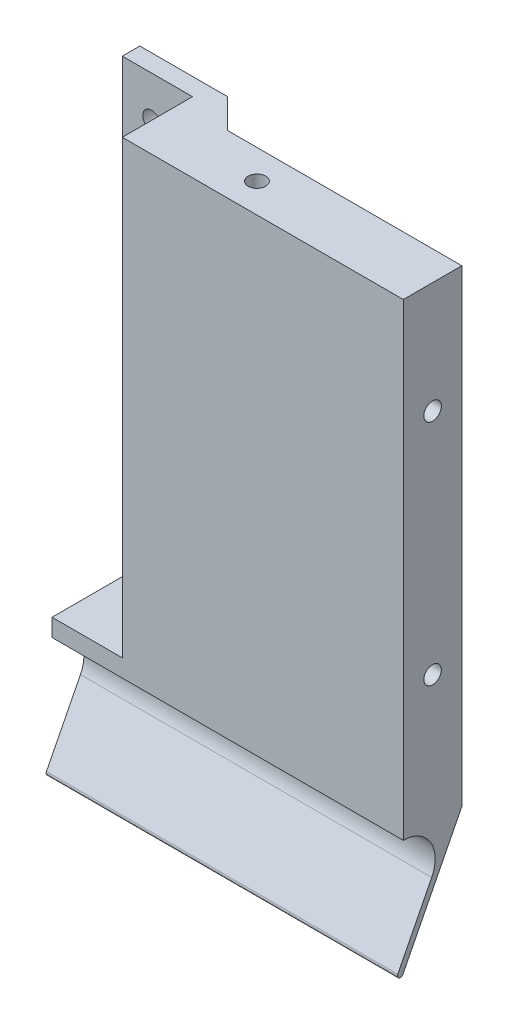
ISO-10303-21;
HEADER;
FILE_DESCRIPTION(('STEP AP214'),'2;1');
FILE_NAME('part.step','',(''),(''),'','','');
FILE_SCHEMA(('AUTOMOTIVE_DESIGN { 1 0 10303 214 1 1 1 1 }'));
ENDSEC;
DATA;
#1=APPLICATION_CONTEXT('core data for automotive mechanical design processes');
#2=APPLICATION_PROTOCOL_DEFINITION('international standard','automotive_design',2000,#1);
#3=PRODUCT_CONTEXT('',#1,'mechanical');
#4=PRODUCT('Part','Part','',(#3));
#5=PRODUCT_RELATED_PRODUCT_CATEGORY('part','',(#4));
#6=PRODUCT_DEFINITION_FORMATION('','',#4);
#7=PRODUCT_DEFINITION_CONTEXT('part definition',#1,'design');
#8=PRODUCT_DEFINITION('design','',#6,#7);
#9=PRODUCT_DEFINITION_SHAPE('','',#8);
#10=(LENGTH_UNIT() NAMED_UNIT(*) SI_UNIT(.MILLI.,.METRE.));
#11=(NAMED_UNIT(*) PLANE_ANGLE_UNIT() SI_UNIT($,.RADIAN.));
#12=(NAMED_UNIT(*) SI_UNIT($,.STERADIAN.) SOLID_ANGLE_UNIT());
#13=UNCERTAINTY_MEASURE_WITH_UNIT(LENGTH_MEASURE(1.E-05),#10,'distance_accuracy_value','');
#14=(GEOMETRIC_REPRESENTATION_CONTEXT(3) GLOBAL_UNCERTAINTY_ASSIGNED_CONTEXT((#13)) GLOBAL_UNIT_ASSIGNED_CONTEXT((#10,
#11,#12)) REPRESENTATION_CONTEXT('',''));
#15=CARTESIAN_POINT('',(0.,0.,0.));
#16=DIRECTION('',(0.,0.,1.));
#17=DIRECTION('',(1.,0.,0.));
#18=AXIS2_PLACEMENT_3D('',#15,#16,#17);
#19=CARTESIAN_POINT('',(-35.6969058074618,61.,-9.55555555555549));
#20=DIRECTION('',(-1.,0.,0.));
#21=DIRECTION('',(0.,0.,1.));
#22=AXIS2_PLACEMENT_3D('',#19,#20,#21);
#23=CYLINDRICAL_SURFACE('',#22,1.5);
#24=CARTESIAN_POINT('',(-83.6969058074618,61.,-9.55555555555549));
#25=DIRECTION('',(-1.,0.,0.));
#26=DIRECTION('',(0.,0.,1.));
#27=AXIS2_PLACEMENT_3D('',#24,#25,#26);
#28=CIRCLE('',#27,1.5);
#29=CARTESIAN_POINT('',(-83.6969058074618,61.,-8.05555555555549));
#30=VERTEX_POINT('',#29);
#31=EDGE_CURVE('E334',#30,#30,#28,.T.);
#32=ORIENTED_EDGE('',*,*,#31,.T.);
#33=EDGE_LOOP('',(#32));
#34=FACE_BOUND('',#33,.T.);
#35=CARTESIAN_POINT('',(-68.8778857874699,61.,-9.55555555555549));
#36=DIRECTION('',(0.866025403784437,-0.500000000000004,0.));
#37=DIRECTION('',(-0.500000000000004,-0.866025403784437,0.));
#38=AXIS2_PLACEMENT_3D('',#35,#36,#37);
#39=ELLIPSE('',#38,1.73205080756888,1.5);
#40=CARTESIAN_POINT('',(-69.7439111912544,59.5,-9.55555555555549));
#41=VERTEX_POINT('',#40);
#42=EDGE_CURVE('E248',#41,#41,#39,.F.);
#43=ORIENTED_EDGE('',*,*,#42,.F.);
#44=EDGE_LOOP('',(#43));
#45=FACE_BOUND('',#44,.T.);
#46=ADVANCED_FACE('F64',(#34,#45),#23,.F.);
#47=CARTESIAN_POINT('',(0.,80.,-19.5555555555555));
#48=DIRECTION('',(0.,0.,1.));
#49=DIRECTION('',(1.,0.,0.));
#50=AXIS2_PLACEMENT_3D('',#47,#48,#49);
#51=PLANE('',#50);
#52=CARTESIAN_POINT('',(-90.6969058074618,10.,-19.5555555555555));
#53=DIRECTION('',(0.,0.,1.));
#54=DIRECTION('',(1.,0.,0.));
#55=AXIS2_PLACEMENT_3D('',#52,#53,#54);
#56=CIRCLE('',#55,1.5);
#57=CARTESIAN_POINT('',(-89.1969058074618,10.,-19.5555555555555));
#58=VERTEX_POINT('',#57);
#59=EDGE_CURVE('E341',#58,#58,#56,.T.);
#60=ORIENTED_EDGE('',*,*,#59,.T.);
#61=EDGE_LOOP('',(#60));
#62=FACE_BOUND('',#61,.T.);
#63=CARTESIAN_POINT('',(-90.6969058074618,73.,-19.5555555555555));
#64=DIRECTION('',(0.,0.,1.));
#65=DIRECTION('',(1.,0.,0.));
#66=AXIS2_PLACEMENT_3D('',#63,#64,#65);
#67=CIRCLE('',#66,1.5);
#68=CARTESIAN_POINT('',(-89.1969058074618,73.,-19.5555555555555));
#69=VERTEX_POINT('',#68);
#70=EDGE_CURVE('E537',#69,#69,#67,.T.);
#71=ORIENTED_EDGE('',*,*,#70,.T.);
#72=EDGE_LOOP('',(#71));
#73=FACE_BOUND('',#72,.T.);
#74=DIRECTION('',(-1.,0.,0.));
#75=VECTOR('',#74,1.);
#76=CARTESIAN_POINT('',(0.,0.,-19.5555555555555));
#77=LINE('',#76,#75);
#78=CARTESIAN_POINT('',(-80.6969058074618,0.,-19.5555555555555));
#79=VERTEX_POINT('',#78);
#80=CARTESIAN_POINT('',(-95.6969058074618,0.,-19.5555555555555));
#81=VERTEX_POINT('',#80);
#82=EDGE_CURVE('E363',#79,#81,#77,.T.);
#83=ORIENTED_EDGE('',*,*,#82,.T.);
#84=DIRECTION('',(0.,-1.,0.));
#85=VECTOR('',#84,1.);
#86=CARTESIAN_POINT('',(-95.6969058074618,80.,-19.5555555555555));
#87=LINE('',#86,#85);
#88=CARTESIAN_POINT('',(-95.6969058074618,80.,-19.5555555555555));
#89=VERTEX_POINT('',#88);
#90=EDGE_CURVE('E244',#89,#81,#87,.T.);
#91=ORIENTED_EDGE('',*,*,#90,.F.);
#92=DIRECTION('',(-1.,0.,0.));
#93=VECTOR('',#92,1.);
#94=CARTESIAN_POINT('',(0.,80.,-19.5555555555555));
#95=LINE('',#94,#93);
#96=CARTESIAN_POINT('',(-80.6969058074618,80.,-19.5555555555555));
#97=VERTEX_POINT('',#96);
#98=EDGE_CURVE('E364',#97,#89,#95,.T.);
#99=ORIENTED_EDGE('',*,*,#98,.F.);
#100=DIRECTION('',(0.,-1.,0.));
#101=VECTOR('',#100,1.);
#102=CARTESIAN_POINT('',(-80.6969058074618,80.,-19.5555555555555));
#103=LINE('',#102,#101);
#104=EDGE_CURVE('E234',#97,#79,#103,.T.);
#105=ORIENTED_EDGE('',*,*,#104,.T.);
#106=EDGE_LOOP('',(#83,#91,#99,#105));
#107=FACE_BOUND('',#106,.T.);
#108=ADVANCED_FACE('F302',(#62,#73,#107),#51,.F.);
#109=CARTESIAN_POINT('',(-95.6969058074618,80.,0.));
#110=DIRECTION('',(1.,0.,0.));
#111=DIRECTION('',(0.,0.,-1.));
#112=AXIS2_PLACEMENT_3D('',#109,#110,#111);
#113=PLANE('',#112);
#114=DIRECTION('',(0.,0.,1.));
#115=VECTOR('',#114,1.);
#116=CARTESIAN_POINT('',(-95.6969058074618,0.,0.));
#117=LINE('',#116,#115);
#118=CARTESIAN_POINT('',(-95.6969058074618,0.,-14.5555555555555));
#119=VERTEX_POINT('',#118);
#120=EDGE_CURVE('E219',#81,#119,#117,.T.);
#121=ORIENTED_EDGE('',*,*,#120,.T.);
#122=DIRECTION('',(0.,-0.891453862605462,0.453111477283243));
#123=VECTOR('',#122,1.);
#124=CARTESIAN_POINT('',(-95.6969058074618,0.,-14.5555555555555));
#125=LINE('',#124,#123);
#126=CARTESIAN_POINT('',(-95.6969058074618,-19.7808288073389,-4.50128248685819));
#127=VERTEX_POINT('',#126);
#128=EDGE_CURVE('E432',#119,#127,#125,.T.);
#129=ORIENTED_EDGE('',*,*,#128,.T.);
#130=CARTESIAN_POINT('',(-95.6969058074618,-19.5542730686973,-4.05555555555545));
#131=DIRECTION('',(1.,0.,0.));
#132=DIRECTION('',(0.,0.,-1.));
#133=AXIS2_PLACEMENT_3D('',#130,#131,#132);
#134=CIRCLE('',#133,0.499999999999997);
#135=CARTESIAN_POINT('',(-95.6969058074618,-19.3277173300557,-3.60982862425272));
#136=VERTEX_POINT('',#135);
#137=EDGE_CURVE('E438',#127,#136,#134,.F.);
#138=ORIENTED_EDGE('',*,*,#137,.T.);
#139=DIRECTION('',(0.,0.891453862605462,-0.453111477283243));
#140=VECTOR('',#139,1.);
#141=CARTESIAN_POINT('',(-95.6969058074618,-19.3277173300557,-3.60982862425272));
#142=LINE('',#141,#140);
#143=CARTESIAN_POINT('',(-95.6969058074618,-7.91453862605462,-9.41096144783254));
#144=VERTEX_POINT('',#143);
#145=EDGE_CURVE('E443',#136,#144,#142,.T.);
#146=ORIENTED_EDGE('',*,*,#145,.T.);
#147=CARTESIAN_POINT('',(-95.6969058074618,-5.44661490173606,-4.55555555555545));
#148=DIRECTION('',(1.,0.,0.));
#149=DIRECTION('',(0.,0.,-1.));
#150=AXIS2_PLACEMENT_3D('',#147,#148,#149);
#151=CIRCLE('',#150,5.44661490173606);
#152=CARTESIAN_POINT('',(-95.6969058074618,0.,-4.55555555555549));
#153=VERTEX_POINT('',#152);
#154=EDGE_CURVE('E437',#144,#153,#151,.T.);
#155=ORIENTED_EDGE('',*,*,#154,.T.);
#156=DIRECTION('',(0.,-1.,0.));
#157=VECTOR('',#156,1.);
#158=CARTESIAN_POINT('',(-95.6969058074618,3.,-4.55555555555549));
#159=LINE('',#158,#157);
#160=CARTESIAN_POINT('',(-95.6969058074618,3.,-4.55555555555549));
#161=VERTEX_POINT('',#160);
#162=EDGE_CURVE('E216',#161,#153,#159,.T.);
#163=ORIENTED_EDGE('',*,*,#162,.F.);
#164=DIRECTION('',(0.,0.,1.));
#165=VECTOR('',#164,1.);
#166=CARTESIAN_POINT('',(-95.6969058074618,3.,0.));
#167=LINE('',#166,#165);
#168=CARTESIAN_POINT('',(-95.6969058074618,3.,-16.5555555555555));
#169=VERTEX_POINT('',#168);
#170=EDGE_CURVE('E345',#169,#161,#167,.T.);
#171=ORIENTED_EDGE('',*,*,#170,.F.);
#172=DIRECTION('',(0.,-1.,0.));
#173=VECTOR('',#172,1.);
#174=CARTESIAN_POINT('',(-95.6969058074618,80.,-16.5555555555555));
#175=LINE('',#174,#173);
#176=CARTESIAN_POINT('',(-95.6969058074618,80.,-16.5555555555555));
#177=VERTEX_POINT('',#176);
#178=EDGE_CURVE('E241',#177,#169,#175,.T.);
#179=ORIENTED_EDGE('',*,*,#178,.F.);
#180=DIRECTION('',(0.,0.,1.));
#181=VECTOR('',#180,1.);
#182=CARTESIAN_POINT('',(-95.6969058074618,80.,0.));
#183=LINE('',#182,#181);
#184=EDGE_CURVE('E368',#89,#177,#183,.T.);
#185=ORIENTED_EDGE('',*,*,#184,.F.);
#186=ORIENTED_EDGE('',*,*,#90,.T.);
#187=EDGE_LOOP('',(#121,#129,#138,#146,#155,#163,#171,#179,#185,#186));
#188=FACE_BOUND('',#187,.T.);
#189=ADVANCED_FACE('F309',(#188),#113,.F.);
#190=CARTESIAN_POINT('',(0.,80.,-16.5555555555555));
#191=DIRECTION('',(0.,0.,-1.));
#192=DIRECTION('',(-1.,0.,0.));
#193=AXIS2_PLACEMENT_3D('',#190,#191,#192);
#194=PLANE('',#193);
#195=CARTESIAN_POINT('',(-90.6969058074618,10.,-16.5555555555555));
#196=DIRECTION('',(0.,0.,1.));
#197=DIRECTION('',(1.,0.,0.));
#198=AXIS2_PLACEMENT_3D('',#195,#196,#197);
#199=CIRCLE('',#198,1.5);
#200=CARTESIAN_POINT('',(-89.1969058074618,10.,-16.5555555555555));
#201=VERTEX_POINT('',#200);
#202=EDGE_CURVE('E533',#201,#201,#199,.T.);
#203=ORIENTED_EDGE('',*,*,#202,.F.);
#204=EDGE_LOOP('',(#203));
#205=FACE_BOUND('',#204,.T.);
#206=CARTESIAN_POINT('',(-90.6969058074618,73.,-16.5555555555555));
#207=DIRECTION('',(0.,0.,1.));
#208=DIRECTION('',(1.,0.,0.));
#209=AXIS2_PLACEMENT_3D('',#206,#207,#208);
#210=CIRCLE('',#209,1.5);
#211=CARTESIAN_POINT('',(-89.1969058074618,73.,-16.5555555555555));
#212=VERTEX_POINT('',#211);
#213=EDGE_CURVE('E257',#212,#212,#210,.T.);
#214=ORIENTED_EDGE('',*,*,#213,.F.);
#215=EDGE_LOOP('',(#214));
#216=FACE_BOUND('',#215,.T.);
#217=ORIENTED_EDGE('',*,*,#178,.T.);
#218=DIRECTION('',(-1.,0.,0.));
#219=VECTOR('',#218,1.);
#220=CARTESIAN_POINT('',(0.,3.,-16.5555555555555));
#221=LINE('',#220,#219);
#222=CARTESIAN_POINT('',(-83.6969058074618,3.,-16.5555555555555));
#223=VERTEX_POINT('',#222);
#224=EDGE_CURVE('E357',#223,#169,#221,.T.);
#225=ORIENTED_EDGE('',*,*,#224,.F.);
#226=DIRECTION('',(0.,-1.,0.));
#227=VECTOR('',#226,1.);
#228=CARTESIAN_POINT('',(-83.6969058074618,80.,-16.5555555555555));
#229=LINE('',#228,#227);
#230=CARTESIAN_POINT('',(-83.6969058074618,80.,-16.5555555555555));
#231=VERTEX_POINT('',#230);
#232=EDGE_CURVE('E231',#231,#223,#229,.T.);
#233=ORIENTED_EDGE('',*,*,#232,.F.);
#234=DIRECTION('',(1.,0.,0.));
#235=VECTOR('',#234,1.);
#236=CARTESIAN_POINT('',(0.,80.,-16.5555555555555));
#237=LINE('',#236,#235);
#238=EDGE_CURVE('E371',#177,#231,#237,.T.);
#239=ORIENTED_EDGE('',*,*,#238,.F.);
#240=EDGE_LOOP('',(#217,#225,#233,#239));
#241=FACE_BOUND('',#240,.T.);
#242=ADVANCED_FACE('F553',(#205,#216,#241),#194,.F.);
#243=CARTESIAN_POINT('',(-83.6969058074618,80.,0.));
#244=DIRECTION('',(1.,0.,0.));
#245=DIRECTION('',(0.,0.,-1.));
#246=AXIS2_PLACEMENT_3D('',#243,#244,#245);
#247=PLANE('',#246);
#248=CARTESIAN_POINT('',(-83.6969058074618,22.,-9.55555555555549));
#249=DIRECTION('',(-1.,0.,0.));
#250=DIRECTION('',(0.,0.,1.));
#251=AXIS2_PLACEMENT_3D('',#248,#249,#250);
#252=CIRCLE('',#251,1.5);
#253=CARTESIAN_POINT('',(-83.6969058074618,22.,-8.05555555555549));
#254=VERTEX_POINT('',#253);
#255=EDGE_CURVE('E333',#254,#254,#252,.T.);
#256=ORIENTED_EDGE('',*,*,#255,.F.);
#257=EDGE_LOOP('',(#256));
#258=FACE_BOUND('',#257,.T.);
#259=ORIENTED_EDGE('',*,*,#31,.F.);
#260=EDGE_LOOP('',(#259));
#261=FACE_BOUND('',#260,.T.);
#262=ORIENTED_EDGE('',*,*,#232,.T.);
#263=DIRECTION('',(0.,0.,-1.));
#264=VECTOR('',#263,1.);
#265=CARTESIAN_POINT('',(-83.6969058074618,3.,0.));
#266=LINE('',#265,#264);
#267=CARTESIAN_POINT('',(-83.6969058074618,3.,-4.55555555555549));
#268=VERTEX_POINT('',#267);
#269=EDGE_CURVE('E353',#268,#223,#266,.T.);
#270=ORIENTED_EDGE('',*,*,#269,.F.);
#271=DIRECTION('',(0.,-1.,0.));
#272=VECTOR('',#271,1.);
#273=CARTESIAN_POINT('',(-83.6969058074618,80.,-4.55555555555549));
#274=LINE('',#273,#272);
#275=CARTESIAN_POINT('',(-83.6969058074618,80.,-4.55555555555549));
#276=VERTEX_POINT('',#275);
#277=EDGE_CURVE('E225',#276,#268,#274,.T.);
#278=ORIENTED_EDGE('',*,*,#277,.F.);
#279=DIRECTION('',(0.,0.,1.));
#280=VECTOR('',#279,1.);
#281=CARTESIAN_POINT('',(-83.6969058074618,80.,0.));
#282=LINE('',#281,#280);
#283=EDGE_CURVE('E374',#231,#276,#282,.T.);
#284=ORIENTED_EDGE('',*,*,#283,.F.);
#285=EDGE_LOOP('',(#262,#270,#278,#284));
#286=FACE_BOUND('',#285,.T.);
#287=ADVANCED_FACE('F550',(#258,#261,#286),#247,.F.);
#288=CARTESIAN_POINT('',(0.,80.,-4.5555555555555));
#289=DIRECTION('',(0.,0.,-1.));
#290=DIRECTION('',(-1.,0.,0.));
#291=AXIS2_PLACEMENT_3D('',#288,#289,#290);
#292=PLANE('',#291);
#293=DIRECTION('',(1.,0.,0.));
#294=VECTOR('',#293,1.);
#295=CARTESIAN_POINT('',(0.,0.,-4.5555555555555));
#296=LINE('',#295,#294);
#297=CARTESIAN_POINT('',(-35.6969058074618,0.,-4.5555555555555));
#298=VERTEX_POINT('',#297);
#299=EDGE_CURVE('E197',#153,#298,#296,.T.);
#300=ORIENTED_EDGE('',*,*,#299,.T.);
#301=DIRECTION('',(0.,-1.,0.));
#302=VECTOR('',#301,1.);
#303=CARTESIAN_POINT('',(-35.6969058074618,80.,-4.5555555555555));
#304=LINE('',#303,#302);
#305=CARTESIAN_POINT('',(-35.6969058074618,80.,-4.5555555555555));
#306=VERTEX_POINT('',#305);
#307=EDGE_CURVE('E213',#306,#298,#304,.T.);
#308=ORIENTED_EDGE('',*,*,#307,.F.);
#309=DIRECTION('',(1.,0.,0.));
#310=VECTOR('',#309,1.);
#311=CARTESIAN_POINT('',(0.,80.,-4.5555555555555));
#312=LINE('',#311,#310);
#313=EDGE_CURVE('E377',#276,#306,#312,.T.);
#314=ORIENTED_EDGE('',*,*,#313,.F.);
#315=ORIENTED_EDGE('',*,*,#277,.T.);
#316=DIRECTION('',(1.,0.,0.));
#317=VECTOR('',#316,1.);
#318=CARTESIAN_POINT('',(0.,3.,-4.55555555555549));
#319=LINE('',#318,#317);
#320=EDGE_CURVE('E349',#161,#268,#319,.T.);
#321=ORIENTED_EDGE('',*,*,#320,.F.);
#322=ORIENTED_EDGE('',*,*,#162,.T.);
#323=EDGE_LOOP('',(#300,#308,#314,#315,#321,#322));
#324=FACE_BOUND('',#323,.T.);
#325=ADVANCED_FACE('F211',(#324),#292,.F.);
#326=CARTESIAN_POINT('',(-35.6969058074618,80.,0.));
#327=DIRECTION('',(-1.,0.,0.));
#328=DIRECTION('',(0.,0.,1.));
#329=AXIS2_PLACEMENT_3D('',#326,#327,#328);
#330=PLANE('',#329);
#331=CARTESIAN_POINT('',(-35.6969058074618,22.,-9.55555555555549));
#332=DIRECTION('',(-1.,0.,0.));
#333=DIRECTION('',(0.,0.,1.));
#334=AXIS2_PLACEMENT_3D('',#331,#332,#333);
#335=CIRCLE('',#334,1.5);
#336=CARTESIAN_POINT('',(-35.6969058074618,22.,-8.05555555555549));
#337=VERTEX_POINT('',#336);
#338=EDGE_CURVE('E339',#337,#337,#335,.T.);
#339=ORIENTED_EDGE('',*,*,#338,.T.);
#340=EDGE_LOOP('',(#339));
#341=FACE_BOUND('',#340,.T.);
#342=CARTESIAN_POINT('',(-35.6969058074618,61.,-9.55555555555549));
#343=DIRECTION('',(-1.,0.,0.));
#344=DIRECTION('',(0.,0.,1.));
#345=AXIS2_PLACEMENT_3D('',#342,#343,#344);
#346=CIRCLE('',#345,1.5);
#347=CARTESIAN_POINT('',(-35.6969058074618,61.,-8.05555555555549));
#348=VERTEX_POINT('',#347);
#349=EDGE_CURVE('E330',#348,#348,#346,.T.);
#350=ORIENTED_EDGE('',*,*,#349,.T.);
#351=EDGE_LOOP('',(#350));
#352=FACE_BOUND('',#351,.T.);
#353=ORIENTED_EDGE('',*,*,#307,.T.);
#354=CARTESIAN_POINT('',(-35.6969058074618,-5.44661490173606,-4.5555555555555));
#355=DIRECTION('',(-1.,0.,0.));
#356=DIRECTION('',(0.,0.,-1.));
#357=AXIS2_PLACEMENT_3D('',#354,#355,#356);
#358=CIRCLE('',#357,5.44661490173606);
#359=CARTESIAN_POINT('',(-35.6969058074619,-7.91453862605462,-9.41096144783258));
#360=VERTEX_POINT('',#359);
#361=EDGE_CURVE('E193',#298,#360,#358,.T.);
#362=ORIENTED_EDGE('',*,*,#361,.T.);
#363=DIRECTION('',(0.,-0.891453862605462,0.453111477283243));
#364=VECTOR('',#363,1.);
#365=CARTESIAN_POINT('',(-35.6969058074618,-19.3277173300557,-3.60982862425277));
#366=LINE('',#365,#364);
#367=CARTESIAN_POINT('',(-35.6969058074618,-19.3277173300557,-3.60982862425277));
#368=VERTEX_POINT('',#367);
#369=EDGE_CURVE('E206',#360,#368,#366,.T.);
#370=ORIENTED_EDGE('',*,*,#369,.T.);
#371=CARTESIAN_POINT('',(-35.6969058074618,-19.5542730686973,-4.0555555555555));
#372=DIRECTION('',(1.,0.,0.));
#373=DIRECTION('',(0.,0.,1.));
#374=AXIS2_PLACEMENT_3D('',#371,#372,#373);
#375=CIRCLE('',#374,0.499999999999997);
#376=CARTESIAN_POINT('',(-35.6969058074618,-19.7808288073389,-4.50128248685822));
#377=VERTEX_POINT('',#376);
#378=EDGE_CURVE('E449',#368,#377,#375,.T.);
#379=ORIENTED_EDGE('',*,*,#378,.T.);
#380=DIRECTION('',(0.,0.891453862605462,-0.453111477283243));
#381=VECTOR('',#380,1.);
#382=CARTESIAN_POINT('',(-35.6969058074619,0.,-14.5555555555555));
#383=LINE('',#382,#381);
#384=CARTESIAN_POINT('',(-35.6969058074619,0.,-14.5555555555555));
#385=VERTEX_POINT('',#384);
#386=EDGE_CURVE('E453',#377,#385,#383,.T.);
#387=ORIENTED_EDGE('',*,*,#386,.T.);
#388=DIRECTION('',(0.,-1.,0.));
#389=VECTOR('',#388,1.);
#390=CARTESIAN_POINT('',(-35.6969058074619,80.,-14.5555555555555));
#391=LINE('',#390,#389);
#392=CARTESIAN_POINT('',(-35.6969058074619,80.,-14.5555555555555));
#393=VERTEX_POINT('',#392);
#394=EDGE_CURVE('E226',#393,#385,#391,.T.);
#395=ORIENTED_EDGE('',*,*,#394,.F.);
#396=DIRECTION('',(0.,0.,-1.));
#397=VECTOR('',#396,1.);
#398=CARTESIAN_POINT('',(-35.6969058074618,80.,0.));
#399=LINE('',#398,#397);
#400=EDGE_CURVE('E223',#306,#393,#399,.T.);
#401=ORIENTED_EDGE('',*,*,#400,.F.);
#402=EDGE_LOOP('',(#353,#362,#370,#379,#387,#395,#401));
#403=FACE_BOUND('',#402,.T.);
#404=ADVANCED_FACE('F221',(#341,#352,#403),#330,.F.);
#405=CARTESIAN_POINT('',(0.,80.,-14.5555555555555));
#406=DIRECTION('',(0.,0.,1.));
#407=DIRECTION('',(1.,0.,0.));
#408=AXIS2_PLACEMENT_3D('',#405,#406,#407);
#409=PLANE('',#408);
#410=CARTESIAN_POINT('',(-58.1969058074619,57.5,-14.5555555555555));
#411=DIRECTION('',(0.,0.,-1.));
#412=DIRECTION('',(-1.,0.,0.));
#413=AXIS2_PLACEMENT_3D('',#410,#411,#412);
#414=CIRCLE('',#413,11.);
#415=CARTESIAN_POINT('',(-48.6706263658331,52.,-14.5555555555555));
#416=VERTEX_POINT('',#415);
#417=CARTESIAN_POINT('',(-67.7231852490907,51.9999999999999,-14.5555555555555));
#418=VERTEX_POINT('',#417);
#419=EDGE_CURVE('E495',#416,#418,#414,.T.);
#420=ORIENTED_EDGE('',*,*,#419,.F.);
#421=DIRECTION('',(-0.500000000000005,-0.866025403784436,0.));
#422=VECTOR('',#421,1.);
#423=CARTESIAN_POINT('',(-59.0196302727701,34.0749994254564,-14.5555555555555));
#424=LINE('',#423,#422);
#425=CARTESIAN_POINT('',(-45.4951998852901,57.5,-14.5555555555555));
#426=VERTEX_POINT('',#425);
#427=EDGE_CURVE('E267',#426,#416,#424,.T.);
#428=ORIENTED_EDGE('',*,*,#427,.F.);
#429=DIRECTION('',(0.500000000000004,-0.866025403784436,0.));
#430=VECTOR('',#429,1.);
#431=CARTESIAN_POINT('',(-9.22316955516462,-5.32499942545591,-14.5555555555555));
#432=LINE('',#431,#430);
#433=CARTESIAN_POINT('',(-48.6706263658331,63.0000000000001,-14.5555555555555));
#434=VERTEX_POINT('',#433);
#435=EDGE_CURVE('E474',#434,#426,#432,.T.);
#436=ORIENTED_EDGE('',*,*,#435,.F.);
#437=CARTESIAN_POINT('',(-58.1969058074619,57.5,-14.5555555555555));
#438=DIRECTION('',(0.,0.,-1.));
#439=DIRECTION('',(-1.,0.,0.));
#440=AXIS2_PLACEMENT_3D('',#437,#438,#439);
#441=CIRCLE('',#440,11.);
#442=CARTESIAN_POINT('',(-67.7231852490907,63.0000000000001,-14.5555555555555));
#443=VERTEX_POINT('',#442);
#444=EDGE_CURVE('E507',#443,#434,#441,.T.);
#445=ORIENTED_EDGE('',*,*,#444,.F.);
#446=DIRECTION('',(-0.500000000000004,-0.866025403784437,0.));
#447=VECTOR('',#446,1.);
#448=CARTESIAN_POINT('',(-78.0721891560277,45.0749994254564,-14.5555555555555));
#449=LINE('',#448,#447);
#450=CARTESIAN_POINT('',(-70.8986117296337,57.5,-14.5555555555555));
#451=VERTEX_POINT('',#450);
#452=EDGE_CURVE('E503',#443,#451,#449,.T.);
#453=ORIENTED_EDGE('',*,*,#452,.T.);
#454=DIRECTION('',(0.5,-0.866025403784439,0.));
#455=VECTOR('',#454,1.);
#456=CARTESIAN_POINT('',(-28.2757284384226,-16.3249994254561,-14.5555555555555));
#457=LINE('',#456,#455);
#458=EDGE_CURVE('E499',#451,#418,#457,.T.);
#459=ORIENTED_EDGE('',*,*,#458,.T.);
#460=EDGE_LOOP('',(#420,#428,#436,#445,#453,#459));
#461=FACE_BOUND('',#460,.T.);
#462=DIRECTION('',(-1.,0.,0.));
#463=VECTOR('',#462,1.);
#464=CARTESIAN_POINT('',(0.,0.,-14.5555555555555));
#465=LINE('',#464,#463);
#466=CARTESIAN_POINT('',(-75.6969058074618,0.,-14.5555555555555));
#467=VERTEX_POINT('',#466);
#468=EDGE_CURVE('E218',#385,#467,#465,.T.);
#469=ORIENTED_EDGE('',*,*,#468,.T.);
#470=DIRECTION('',(0.,1.,0.));
#471=VECTOR('',#470,1.);
#472=CARTESIAN_POINT('',(-75.6969058074618,80.,-14.5555555555555));
#473=LINE('',#472,#471);
#474=CARTESIAN_POINT('',(-75.6969058074618,80.,-14.5555555555555));
#475=VERTEX_POINT('',#474);
#476=EDGE_CURVE('E88',#467,#475,#473,.T.);
#477=ORIENTED_EDGE('',*,*,#476,.T.);
#478=DIRECTION('',(-1.,0.,0.));
#479=VECTOR('',#478,1.);
#480=CARTESIAN_POINT('',(0.,80.,-14.5555555555555));
#481=LINE('',#480,#479);
#482=EDGE_CURVE('E382',#393,#475,#481,.T.);
#483=ORIENTED_EDGE('',*,*,#482,.F.);
#484=ORIENTED_EDGE('',*,*,#394,.T.);
#485=EDGE_LOOP('',(#469,#477,#483,#484));
#486=FACE_BOUND('',#485,.T.);
#487=ADVANCED_FACE('F575',(#461,#486),#409,.F.);
#488=CARTESIAN_POINT('',(0.,80.,0.));
#489=DIRECTION('',(0.,1.,0.));
#490=DIRECTION('',(0.,0.,1.));
#491=AXIS2_PLACEMENT_3D('',#488,#489,#490);
#492=PLANE('',#491);
#493=CARTESIAN_POINT('',(-65.6969058074618,80.,-9.5555555555555));
#494=DIRECTION('',(0.,1.,0.));
#495=DIRECTION('',(0.,0.,1.));
#496=AXIS2_PLACEMENT_3D('',#493,#494,#495);
#497=CIRCLE('',#496,1.5);
#498=CARTESIAN_POINT('',(-65.6969058074618,80.,-8.0555555555555));
#499=VERTEX_POINT('',#498);
#500=EDGE_CURVE('E268',#499,#499,#497,.T.);
#501=ORIENTED_EDGE('',*,*,#500,.F.);
#502=EDGE_LOOP('',(#501));
#503=FACE_BOUND('',#502,.T.);
#504=ORIENTED_EDGE('',*,*,#98,.T.);
#505=ORIENTED_EDGE('',*,*,#184,.T.);
#506=ORIENTED_EDGE('',*,*,#238,.T.);
#507=ORIENTED_EDGE('',*,*,#283,.T.);
#508=ORIENTED_EDGE('',*,*,#313,.T.);
#509=ORIENTED_EDGE('',*,*,#400,.T.);
#510=ORIENTED_EDGE('',*,*,#482,.T.);
#511=DIRECTION('',(0.707106781186551,0.,0.707106781186544));
#512=VECTOR('',#511,1.);
#513=CARTESIAN_POINT('',(-80.6969058074618,80.,-19.5555555555555));
#514=LINE('',#513,#512);
#515=EDGE_CURVE('E12',#475,#97,#514,.F.);
#516=ORIENTED_EDGE('',*,*,#515,.T.);
#517=EDGE_LOOP('',(#504,#505,#506,#507,#508,#509,#510,#516));
#518=FACE_BOUND('',#517,.T.);
#519=ADVANCED_FACE('F408',(#503,#518),#492,.T.);
#520=CARTESIAN_POINT('',(0.,0.,0.));
#521=DIRECTION('',(0.,1.,0.));
#522=DIRECTION('',(0.,0.,1.));
#523=AXIS2_PLACEMENT_3D('',#520,#521,#522);
#524=PLANE('',#523);
#525=ORIENTED_EDGE('',*,*,#82,.F.);
#526=DIRECTION('',(-0.707106781186551,0.,-0.707106781186544));
#527=VECTOR('',#526,1.);
#528=CARTESIAN_POINT('',(-30.5706751259527,0.,30.5706751259531));
#529=LINE('',#528,#527);
#530=EDGE_CURVE('E74',#79,#467,#529,.F.);
#531=ORIENTED_EDGE('',*,*,#530,.T.);
#532=DIRECTION('',(1.,0.,0.));
#533=VECTOR('',#532,1.);
#534=CARTESIAN_POINT('',(-118.569900108906,0.,-14.5555555555554));
#535=LINE('',#534,#533);
#536=EDGE_CURVE('E81',#119,#467,#535,.T.);
#537=ORIENTED_EDGE('',*,*,#536,.F.);
#538=ORIENTED_EDGE('',*,*,#120,.F.);
#539=EDGE_LOOP('',(#525,#531,#537,#538));
#540=FACE_BOUND('',#539,.T.);
#541=ADVANCED_FACE('F324',(#540),#524,.F.);
#542=CARTESIAN_POINT('',(0.,3.,0.));
#543=DIRECTION('',(0.,1.,0.));
#544=DIRECTION('',(0.,0.,1.));
#545=AXIS2_PLACEMENT_3D('',#542,#543,#544);
#546=PLANE('',#545);
#547=ORIENTED_EDGE('',*,*,#170,.T.);
#548=ORIENTED_EDGE('',*,*,#320,.T.);
#549=ORIENTED_EDGE('',*,*,#269,.T.);
#550=ORIENTED_EDGE('',*,*,#224,.T.);
#551=EDGE_LOOP('',(#547,#548,#549,#550));
#552=FACE_BOUND('',#551,.T.);
#553=ADVANCED_FACE('F317',(#552),#546,.T.);
#554=CARTESIAN_POINT('',(-47.5159258274538,61.,-9.55555555555549));
#555=DIRECTION('',(0.866025403784436,0.500000000000004,0.));
#556=DIRECTION('',(-0.500000000000004,0.866025403784436,0.));
#557=AXIS2_PLACEMENT_3D('',#554,#555,#556);
#558=ELLIPSE('',#557,1.73205080756888,1.5);
#559=CARTESIAN_POINT('',(-48.3819512312382,62.5,-9.55555555555549));
#560=VERTEX_POINT('',#559);
#561=EDGE_CURVE('E252',#560,#560,#558,.F.);
#562=ORIENTED_EDGE('',*,*,#561,.T.);
#563=EDGE_LOOP('',(#562));
#564=FACE_BOUND('',#563,.T.);
#565=ORIENTED_EDGE('',*,*,#349,.F.);
#566=EDGE_LOOP('',(#565));
#567=FACE_BOUND('',#566,.T.);
#568=ADVANCED_FACE('F305',(#564,#567),#23,.F.);
#569=CARTESIAN_POINT('',(-35.6969058074618,22.,-9.55555555555549));
#570=DIRECTION('',(-1.,0.,0.));
#571=DIRECTION('',(0.,0.,1.));
#572=AXIS2_PLACEMENT_3D('',#569,#570,#571);
#573=CYLINDRICAL_SURFACE('',#572,1.5);
#574=ORIENTED_EDGE('',*,*,#338,.F.);
#575=EDGE_LOOP('',(#574));
#576=FACE_BOUND('',#575,.T.);
#577=ORIENTED_EDGE('',*,*,#255,.T.);
#578=EDGE_LOOP('',(#577));
#579=FACE_BOUND('',#578,.T.);
#580=ADVANCED_FACE('F316',(#576,#579),#573,.F.);
#581=CARTESIAN_POINT('',(-90.6969058074618,73.,-19.5555555555555));
#582=DIRECTION('',(0.,0.,1.));
#583=DIRECTION('',(1.,0.,0.));
#584=AXIS2_PLACEMENT_3D('',#581,#582,#583);
#585=CYLINDRICAL_SURFACE('',#584,1.5);
#586=ORIENTED_EDGE('',*,*,#70,.F.);
#587=EDGE_LOOP('',(#586));
#588=FACE_BOUND('',#587,.T.);
#589=ORIENTED_EDGE('',*,*,#213,.T.);
#590=EDGE_LOOP('',(#589));
#591=FACE_BOUND('',#590,.T.);
#592=ADVANCED_FACE('F296',(#588,#591),#585,.F.);
#593=CARTESIAN_POINT('',(-90.6969058074618,10.,-19.5555555555555));
#594=DIRECTION('',(0.,0.,1.));
#595=DIRECTION('',(1.,0.,0.));
#596=AXIS2_PLACEMENT_3D('',#593,#594,#595);
#597=CYLINDRICAL_SURFACE('',#596,1.5);
#598=ORIENTED_EDGE('',*,*,#59,.F.);
#599=EDGE_LOOP('',(#598));
#600=FACE_BOUND('',#599,.T.);
#601=ORIENTED_EDGE('',*,*,#202,.T.);
#602=EDGE_LOOP('',(#601));
#603=FACE_BOUND('',#602,.T.);
#604=ADVANCED_FACE('F288',(#600,#603),#597,.F.);
#605=CARTESIAN_POINT('',(-9.22316955516461,-5.32499942545591,-6.5555555555555));
#606=DIRECTION('',(0.866025403784436,0.500000000000004,0.));
#607=DIRECTION('',(-0.500000000000004,0.866025403784436,0.));
#608=AXIS2_PLACEMENT_3D('',#605,#606,#607);
#609=PLANE('',#608);
#610=ORIENTED_EDGE('',*,*,#435,.T.);
#611=DIRECTION('',(0.,0.,-1.));
#612=VECTOR('',#611,1.);
#613=CARTESIAN_POINT('',(-45.4951998852901,57.5,-6.55555555555549));
#614=LINE('',#613,#612);
#615=CARTESIAN_POINT('',(-45.4951998852901,57.5,-6.55555555555549));
#616=VERTEX_POINT('',#615);
#617=EDGE_CURVE('E253',#616,#426,#614,.T.);
#618=ORIENTED_EDGE('',*,*,#617,.F.);
#619=DIRECTION('',(0.500000000000004,-0.866025403784436,0.));
#620=VECTOR('',#619,1.);
#621=CARTESIAN_POINT('',(-9.22316955516461,-5.32499942545591,-6.5555555555555));
#622=LINE('',#621,#620);
#623=CARTESIAN_POINT('',(-48.6706263658331,63.0000000000001,-6.55555555555549));
#624=VERTEX_POINT('',#623);
#625=EDGE_CURVE('E488',#624,#616,#622,.T.);
#626=ORIENTED_EDGE('',*,*,#625,.F.);
#627=DIRECTION('',(0.,0.,-1.));
#628=VECTOR('',#627,1.);
#629=CARTESIAN_POINT('',(-48.6706263658331,63.0000000000001,-6.55555555555549));
#630=LINE('',#629,#628);
#631=EDGE_CURVE('E515',#624,#434,#630,.T.);
#632=ORIENTED_EDGE('',*,*,#631,.T.);
#633=EDGE_LOOP('',(#610,#618,#626,#632));
#634=FACE_BOUND('',#633,.T.);
#635=ORIENTED_EDGE('',*,*,#561,.F.);
#636=EDGE_LOOP('',(#635));
#637=FACE_BOUND('',#636,.T.);
#638=ADVANCED_FACE('F285',(#634,#637),#609,.F.);
#639=CARTESIAN_POINT('',(-78.0721891560277,45.0749994254564,-6.55555555555549));
#640=DIRECTION('',(0.866025403784437,-0.500000000000004,0.));
#641=DIRECTION('',(0.500000000000004,0.866025403784437,0.));
#642=AXIS2_PLACEMENT_3D('',#639,#640,#641);
#643=PLANE('',#642);
#644=ORIENTED_EDGE('',*,*,#452,.F.);
#645=DIRECTION('',(0.,0.,-1.));
#646=VECTOR('',#645,1.);
#647=CARTESIAN_POINT('',(-67.7231852490907,63.0000000000001,-6.55555555555549));
#648=LINE('',#647,#646);
#649=CARTESIAN_POINT('',(-67.7231852490907,63.0000000000001,-6.55555555555549));
#650=VERTEX_POINT('',#649);
#651=EDGE_CURVE('E518',#650,#443,#648,.T.);
#652=ORIENTED_EDGE('',*,*,#651,.F.);
#653=DIRECTION('',(-0.500000000000004,-0.866025403784437,0.));
#654=VECTOR('',#653,1.);
#655=CARTESIAN_POINT('',(-78.0721891560277,45.0749994254564,-6.55555555555549));
#656=LINE('',#655,#654);
#657=CARTESIAN_POINT('',(-70.8986117296337,57.5,-6.55555555555549));
#658=VERTEX_POINT('',#657);
#659=EDGE_CURVE('E481',#650,#658,#656,.T.);
#660=ORIENTED_EDGE('',*,*,#659,.T.);
#661=DIRECTION('',(0.,0.,-1.));
#662=VECTOR('',#661,1.);
#663=CARTESIAN_POINT('',(-70.8986117296337,57.5,-6.55555555555549));
#664=LINE('',#663,#662);
#665=EDGE_CURVE('E521',#658,#451,#664,.T.);
#666=ORIENTED_EDGE('',*,*,#665,.T.);
#667=EDGE_LOOP('',(#644,#652,#660,#666));
#668=FACE_BOUND('',#667,.T.);
#669=ORIENTED_EDGE('',*,*,#42,.T.);
#670=EDGE_LOOP('',(#669));
#671=FACE_BOUND('',#670,.T.);
#672=ADVANCED_FACE('F287',(#668,#671),#643,.T.);
#673=CARTESIAN_POINT('',(-59.0196302727701,34.0749994254564,-6.55555555555549));
#674=DIRECTION('',(0.866025403784436,-0.500000000000005,0.));
#675=DIRECTION('',(0.500000000000005,0.866025403784436,0.));
#676=AXIS2_PLACEMENT_3D('',#673,#674,#675);
#677=PLANE('',#676);
#678=ORIENTED_EDGE('',*,*,#427,.T.);
#679=DIRECTION('',(0.,0.,-1.));
#680=VECTOR('',#679,1.);
#681=CARTESIAN_POINT('',(-48.6706263658331,52.,-6.55555555555549));
#682=LINE('',#681,#680);
#683=CARTESIAN_POINT('',(-48.6706263658331,52.,-6.55555555555549));
#684=VERTEX_POINT('',#683);
#685=EDGE_CURVE('E492',#684,#416,#682,.T.);
#686=ORIENTED_EDGE('',*,*,#685,.F.);
#687=DIRECTION('',(-0.500000000000005,-0.866025403784436,0.));
#688=VECTOR('',#687,1.);
#689=CARTESIAN_POINT('',(-59.0196302727701,34.0749994254564,-6.55555555555549));
#690=LINE('',#689,#688);
#691=EDGE_CURVE('E469',#616,#684,#690,.T.);
#692=ORIENTED_EDGE('',*,*,#691,.F.);
#693=ORIENTED_EDGE('',*,*,#617,.T.);
#694=EDGE_LOOP('',(#678,#686,#692,#693));
#695=FACE_BOUND('',#694,.T.);
#696=ADVANCED_FACE('F294',(#695),#677,.F.);
#697=CARTESIAN_POINT('',(-58.1969058074619,57.5,-6.55555555555549));
#698=DIRECTION('',(0.,0.,-1.));
#699=DIRECTION('',(-1.,0.,0.));
#700=AXIS2_PLACEMENT_3D('',#697,#698,#699);
#701=CYLINDRICAL_SURFACE('',#700,11.);
#702=CARTESIAN_POINT('',(-65.6969058074618,65.5467384697155,-8.0555555555555));
#703=CARTESIAN_POINT('',(-65.6040905572071,65.6332450411785,-8.0555539878941));
#704=CARTESIAN_POINT('',(-65.5097078270788,65.7181962041507,-8.06415067938404));
#705=CARTESIAN_POINT('',(-65.3200514297286,65.8831114451649,-8.10046337032131));
#706=CARTESIAN_POINT('',(-65.2247775792088,65.9630744700286,-8.12818339260436));
#707=CARTESIAN_POINT('',(-65.0546201349048,66.1012452533093,-8.19752825432347));
#708=CARTESIAN_POINT('',(-64.9792886104235,66.1607070142074,-8.2355309189182));
#709=CARTESIAN_POINT('',(-64.8329592323988,66.273327782454,-8.32633401081901));
#710=CARTESIAN_POINT('',(-64.7619554002721,66.3264955850777,-8.37911343307815));
#711=CARTESIAN_POINT('',(-64.638816802475,66.4166484168781,-8.48967291825745));
#712=CARTESIAN_POINT('',(-64.5855109291063,66.4548532371615,-8.54514684078006));
#713=CARTESIAN_POINT('',(-64.4864817609115,66.5246830368327,-8.66618615589996));
#714=CARTESIAN_POINT('',(-64.4407569374989,66.5563093429912,-8.73174950898645));
#715=CARTESIAN_POINT('',(-64.3590664951931,66.6120937535341,-8.87230302306915));
#716=CARTESIAN_POINT('',(-64.3231689634,66.6361999083304,-8.94735393407141));
#717=CARTESIAN_POINT('',(-64.2639063319606,66.6756629350042,-9.10440300860386));
#718=CARTESIAN_POINT('',(-64.2405324896665,66.6910259108641,-9.18639627932486));
#719=CARTESIAN_POINT('',(-64.2099932766831,66.7110296861924,-9.34404720411205));
#720=CARTESIAN_POINT('',(-64.2011966738825,66.7167510537253,-9.41925520709904));
#721=CARTESIAN_POINT('',(-64.1950777816329,66.7207348321849,-9.57031996326125));
#722=CARTESIAN_POINT('',(-64.1977504222693,66.719000538844,-9.64617641499678));
#723=CARTESIAN_POINT('',(-64.2138809950067,66.7084791747104,-9.79146470835463));
#724=CARTESIAN_POINT('',(-64.2266669410373,66.7001314822388,-9.86100512493021));
#725=CARTESIAN_POINT('',(-64.2615119599269,66.677199117348,-9.99663028695219));
#726=CARTESIAN_POINT('',(-64.2835710339936,66.6626144441165,-10.0627150319485));
#727=CARTESIAN_POINT('',(-64.3365732098931,66.6271857395955,-10.1915376225483));
#728=CARTESIAN_POINT('',(-64.3677321843654,66.6061889665398,-10.254143950901));
#729=CARTESIAN_POINT('',(-64.4372654676775,66.5586799060174,-10.3728966667873));
#730=CARTESIAN_POINT('',(-64.4756418001966,66.5321660713962,-10.4290412353698));
#731=CARTESIAN_POINT('',(-64.5622326779347,66.471380728783,-10.5393809449893));
#732=CARTESIAN_POINT('',(-64.6110468736677,66.4365990536265,-10.5928221697501));
#733=CARTESIAN_POINT('',(-64.7136841929008,66.3620335386087,-10.6905931781998));
#734=CARTESIAN_POINT('',(-64.7675104556706,66.3222465581624,-10.734917194868));
#735=CARTESIAN_POINT('',(-64.9018673272633,66.2208478450532,-10.8312189644871));
#736=CARTESIAN_POINT('',(-64.9841089579073,66.1570943130161,-10.8785768004256));
#737=CARTESIAN_POINT('',(-65.1515175459047,66.0232003242158,-10.9559458383908));
#738=CARTESIAN_POINT('',(-65.2366897514829,65.9530479930241,-10.9859239980646));
#739=CARTESIAN_POINT('',(-65.430871203099,65.7879500122453,-11.036056014039));
#740=CARTESIAN_POINT('',(-65.5399267522426,65.691532231545,-11.0511641967682));
#741=CARTESIAN_POINT('',(-65.7544410447345,65.4940609185723,-11.0582982897376));
#742=CARTESIAN_POINT('',(-65.8598964579864,65.3930032867683,-11.0503033854501));
#743=CARTESIAN_POINT('',(-66.0664295747699,65.1871443723656,-11.0131679838144));
#744=CARTESIAN_POINT('',(-66.1674133527023,65.0823092845357,-10.9836996434356));
#745=CARTESIAN_POINT('',(-66.3614617923917,64.8729481486006,-10.904393785584));
#746=CARTESIAN_POINT('',(-66.4545265390477,64.7684220971939,-10.8545564865175));
#747=CARTESIAN_POINT('',(-66.6142408647016,64.5824133766998,-10.745515555045));
#748=CARTESIAN_POINT('',(-66.6825659740782,64.5002952708657,-10.6898383030475));
#749=CARTESIAN_POINT('',(-66.8112543626849,64.3412979205533,-10.5636927846231));
#750=CARTESIAN_POINT('',(-66.8716331547762,64.2644086146526,-10.4932540544946));
#751=CARTESIAN_POINT('',(-66.9608454031972,64.1480491228445,-10.3654977027507));
#752=CARTESIAN_POINT('',(-66.9929585691967,64.1054460979894,-10.3133338511578));
#753=CARTESIAN_POINT('',(-67.0519428285463,64.0261581277646,-10.2019577989074));
#754=CARTESIAN_POINT('',(-67.0788215115973,63.9894646274916,-10.1427560066438));
#755=CARTESIAN_POINT('',(-67.1201983773772,63.9324020489256,-10.0318654122703));
#756=CARTESIAN_POINT('',(-67.1361218763053,63.910222034141,-9.98165514734261));
#757=CARTESIAN_POINT('',(-67.1629407124245,63.8726566542746,-9.8774645187188));
#758=CARTESIAN_POINT('',(-67.173841644048,63.8572637301563,-9.82348842719285));
#759=CARTESIAN_POINT('',(-67.1897503866165,63.8347413127001,-9.71236311104691));
#760=CARTESIAN_POINT('',(-67.1946988539044,63.8276950425233,-9.65518778556827));
#761=CARTESIAN_POINT('',(-67.197926658954,63.8231032826248,-9.54027504116203));
#762=CARTESIAN_POINT('',(-67.1962096274853,63.8255526205409,-9.48253794532962));
#763=CARTESIAN_POINT('',(-67.1870447748666,63.8385680777925,-9.37698802815304));
#764=CARTESIAN_POINT('',(-67.1804541900893,63.8479196952929,-9.32893948774448));
#765=CARTESIAN_POINT('',(-67.1630667020218,63.8724551759518,-9.23516597159529));
#766=CARTESIAN_POINT('',(-67.1522674580963,63.8876422844379,-9.18944230485166));
#767=CARTESIAN_POINT('',(-67.1212462941605,63.93095139608,-9.08037647448277));
#768=CARTESIAN_POINT('',(-67.09897739825,63.9618052506199,-9.01870806730396));
#769=CARTESIAN_POINT('',(-67.0485988112065,64.0306480505379,-8.90211709124314));
#770=CARTESIAN_POINT('',(-67.0204743436387,64.0686550229222,-8.84721215879401));
#771=CARTESIAN_POINT('',(-66.9425231609684,64.1723603172078,-8.71456090001083));
#772=CARTESIAN_POINT('',(-66.8894272974421,64.2415494018141,-8.64149284282677));
#773=CARTESIAN_POINT('',(-66.7752277941726,64.3862885033894,-8.5091923078073));
#774=CARTESIAN_POINT('',(-66.7141029753253,64.4618551479736,-8.44999761767073));
#775=CARTESIAN_POINT('',(-66.6038521620031,64.5942529774452,-8.35932158746132));
#776=CARTESIAN_POINT('',(-66.5562691424166,64.6502882366672,-8.32474944497848));
#777=CARTESIAN_POINT('',(-66.458233550495,64.7633382365563,-8.2618101348889));
#778=CARTESIAN_POINT('',(-66.4077795940847,64.8203534402492,-8.23344599263809));
#779=CARTESIAN_POINT('',(-66.2527679103723,64.9917721002645,-8.1576143711991));
#780=CARTESIAN_POINT('',(-66.1443000103392,65.1068638165245,-8.11919801839674));
#781=CARTESIAN_POINT('',(-65.9777902060731,65.2758520785711,-8.08104151736175));
#782=CARTESIAN_POINT('',(-65.9226549345874,65.3306382026315,-8.07157378107742));
#783=CARTESIAN_POINT('',(-65.8108473938017,65.4393931484142,-8.05883100058766));
#784=CARTESIAN_POINT('',(-65.7541749843906,65.4933618949284,-8.0555565228392));
#785=CARTESIAN_POINT('',(-65.6969058074618,65.5467384697155,-8.0555555555555));
#786=B_SPLINE_CURVE_WITH_KNOTS('',3,(#702,#703,#704,#705,#706,#707,#708,#709,#710,#711,#712,
#713,#714,#715,#716,#717,#718,#719,#720,#721,#722,#723,#724,#725,#726,#727,#728,#729,#730,#731,
#732,#733,#734,#735,#736,#737,#738,#739,#740,#741,#742,#743,#744,#745,#746,#747,#748,#749,#750,
#751,#752,#753,#754,#755,#756,#757,#758,#759,#760,#761,#762,#763,#764,#765,#766,#767,#768,#769,
#770,#771,#772,#773,#774,#775,#776,#777,#778,#779,#780,#781,#782,#783,#784,#785),.UNSPECIFIED.,
.T.,.F.,(4,2,2,2,2,2,2,2,2,2,2,2,2,2,2,2,2,2,2,2,2,2,2,2,2,2,2,2,2,2,2,2,2,2,2,2,2,2,2,2,2,4),
(0.,0.380417244446565,0.760914538908241,1.06943578746265,1.37752068289597,1.63416808948249,
1.89076368449756,2.1490944928587,2.40724472762853,2.63385897064402,2.86037305043029,
3.07298541431771,3.28559780589641,3.50373261996364,3.72192868840935,3.96190339888313,
4.2020294398864,4.54313601470807,4.8848889946347,5.3216194379926,5.75874347253189,
6.20268491450652,6.64662159644087,7.00703406479388,7.36673215266906,7.59002626898549,
7.81299417085963,7.98384367727628,8.15450241859199,8.32684881982334,8.4991013552696,
8.64664919992673,8.79427922031988,9.01043702717227,9.22714706343767,9.56661069649976,
9.90698847115146,10.1503917225948,10.3939133293639,10.8795936788211,11.1142985366733,
11.3490248604096),.UNSPECIFIED.);
#787=CARTESIAN_POINT('',(-65.6969058074618,65.5467384697155,-8.0555555555555));
#788=VERTEX_POINT('',#787);
#789=EDGE_CURVE('E258',#788,#788,#786,.T.);
#790=ORIENTED_EDGE('',*,*,#789,.T.);
#791=EDGE_LOOP('',(#790));
#792=FACE_BOUND('',#791,.T.);
#793=ORIENTED_EDGE('',*,*,#444,.T.);
#794=ORIENTED_EDGE('',*,*,#631,.F.);
#795=CARTESIAN_POINT('',(-58.1969058074619,57.5,-6.55555555555549));
#796=DIRECTION('',(0.,0.,-1.));
#797=DIRECTION('',(-1.,0.,0.));
#798=AXIS2_PLACEMENT_3D('',#795,#796,#797);
#799=CIRCLE('',#798,11.);
#800=EDGE_CURVE('E484',#650,#624,#799,.T.);
#801=ORIENTED_EDGE('',*,*,#800,.F.);
#802=ORIENTED_EDGE('',*,*,#651,.T.);
#803=EDGE_LOOP('',(#793,#794,#801,#802));
#804=FACE_BOUND('',#803,.T.);
#805=ADVANCED_FACE('F269',(#792,#804),#701,.F.);
#806=CARTESIAN_POINT('',(-28.2757284384226,-16.3249994254561,-6.5555555555555));
#807=DIRECTION('',(0.866025403784438,0.5,0.));
#808=DIRECTION('',(-0.5,0.866025403784439,0.));
#809=AXIS2_PLACEMENT_3D('',#806,#807,#808);
#810=PLANE('',#809);
#811=ORIENTED_EDGE('',*,*,#458,.F.);
#812=ORIENTED_EDGE('',*,*,#665,.F.);
#813=DIRECTION('',(0.5,-0.866025403784439,0.));
#814=VECTOR('',#813,1.);
#815=CARTESIAN_POINT('',(-28.2757284384226,-16.3249994254561,-6.5555555555555));
#816=LINE('',#815,#814);
#817=CARTESIAN_POINT('',(-67.7231852490907,51.9999999999999,-6.55555555555549));
#818=VERTEX_POINT('',#817);
#819=EDGE_CURVE('E478',#658,#818,#816,.T.);
#820=ORIENTED_EDGE('',*,*,#819,.T.);
#821=DIRECTION('',(0.,0.,-1.));
#822=VECTOR('',#821,1.);
#823=CARTESIAN_POINT('',(-67.7231852490907,51.9999999999999,-6.55555555555549));
#824=LINE('',#823,#822);
#825=EDGE_CURVE('E524',#818,#418,#824,.T.);
#826=ORIENTED_EDGE('',*,*,#825,.T.);
#827=EDGE_LOOP('',(#811,#812,#820,#826));
#828=FACE_BOUND('',#827,.T.);
#829=ADVANCED_FACE('F591',(#828),#810,.T.);
#830=CARTESIAN_POINT('',(-58.1969058074619,57.5,-6.55555555555549));
#831=DIRECTION('',(0.,0.,-1.));
#832=DIRECTION('',(-1.,0.,0.));
#833=AXIS2_PLACEMENT_3D('',#830,#831,#832);
#834=CYLINDRICAL_SURFACE('',#833,11.);
#835=ORIENTED_EDGE('',*,*,#419,.T.);
#836=ORIENTED_EDGE('',*,*,#825,.F.);
#837=CARTESIAN_POINT('',(-58.1969058074619,57.5,-6.55555555555549));
#838=DIRECTION('',(0.,0.,-1.));
#839=DIRECTION('',(-1.,0.,0.));
#840=AXIS2_PLACEMENT_3D('',#837,#838,#839);
#841=CIRCLE('',#840,11.);
#842=EDGE_CURVE('E473',#684,#818,#841,.T.);
#843=ORIENTED_EDGE('',*,*,#842,.F.);
#844=ORIENTED_EDGE('',*,*,#685,.T.);
#845=EDGE_LOOP('',(#835,#836,#843,#844));
#846=FACE_BOUND('',#845,.T.);
#847=ADVANCED_FACE('F283',(#846),#834,.F.);
#848=CARTESIAN_POINT('',(0.,0.,-6.5555555555555));
#849=DIRECTION('',(0.,0.,-1.));
#850=DIRECTION('',(-1.,0.,0.));
#851=AXIS2_PLACEMENT_3D('',#848,#849,#850);
#852=PLANE('',#851);
#853=ORIENTED_EDGE('',*,*,#691,.T.);
#854=ORIENTED_EDGE('',*,*,#842,.T.);
#855=ORIENTED_EDGE('',*,*,#819,.F.);
#856=ORIENTED_EDGE('',*,*,#659,.F.);
#857=ORIENTED_EDGE('',*,*,#800,.T.);
#858=ORIENTED_EDGE('',*,*,#625,.T.);
#859=EDGE_LOOP('',(#853,#854,#855,#856,#857,#858));
#860=FACE_BOUND('',#859,.T.);
#861=ADVANCED_FACE('F279',(#860),#852,.T.);
#862=CARTESIAN_POINT('',(-65.6969058074618,60.,-9.5555555555555));
#863=DIRECTION('',(0.,1.,0.));
#864=DIRECTION('',(0.,0.,1.));
#865=AXIS2_PLACEMENT_3D('',#862,#863,#864);
#866=CYLINDRICAL_SURFACE('',#865,1.5);
#867=ORIENTED_EDGE('',*,*,#500,.T.);
#868=EDGE_LOOP('',(#867));
#869=FACE_BOUND('',#868,.T.);
#870=ORIENTED_EDGE('',*,*,#789,.F.);
#871=EDGE_LOOP('',(#870));
#872=FACE_BOUND('',#871,.T.);
#873=ADVANCED_FACE('F273',(#869,#872),#866,.F.);
#874=CARTESIAN_POINT('',(-118.569900108906,0.,-14.5555555555554));
#875=DIRECTION('',(0.,-0.453111477283243,-0.891453862605462));
#876=DIRECTION('',(0.,0.891453862605462,-0.453111477283243));
#877=AXIS2_PLACEMENT_3D('',#874,#875,#876);
#878=PLANE('',#877);
#879=ORIENTED_EDGE('',*,*,#128,.F.);
#880=ORIENTED_EDGE('',*,*,#536,.T.);
#881=ORIENTED_EDGE('',*,*,#468,.F.);
#882=ORIENTED_EDGE('',*,*,#386,.F.);
#883=DIRECTION('',(1.,0.,0.));
#884=VECTOR('',#883,1.);
#885=CARTESIAN_POINT('',(-118.569900108906,-19.7808288073389,-4.50128248685817));
#886=LINE('',#885,#884);
#887=EDGE_CURVE('E434',#127,#377,#886,.T.);
#888=ORIENTED_EDGE('',*,*,#887,.F.);
#889=EDGE_LOOP('',(#879,#880,#881,#882,#888));
#890=FACE_BOUND('',#889,.T.);
#891=ADVANCED_FACE('F278',(#890),#878,.T.);
#892=CARTESIAN_POINT('',(-118.569900108906,-19.5542730686973,-4.05555555555544));
#893=DIRECTION('',(1.,0.,0.));
#894=DIRECTION('',(0.,0.,-1.));
#895=AXIS2_PLACEMENT_3D('',#892,#893,#894);
#896=CYLINDRICAL_SURFACE('',#895,0.499999999999997);
#897=ORIENTED_EDGE('',*,*,#137,.F.);
#898=ORIENTED_EDGE('',*,*,#887,.T.);
#899=ORIENTED_EDGE('',*,*,#378,.F.);
#900=DIRECTION('',(1.,0.,0.));
#901=VECTOR('',#900,1.);
#902=CARTESIAN_POINT('',(-118.569900108906,-19.3277173300557,-3.60982862425271));
#903=LINE('',#902,#901);
#904=EDGE_CURVE('E461',#136,#368,#903,.T.);
#905=ORIENTED_EDGE('',*,*,#904,.F.);
#906=EDGE_LOOP('',(#897,#898,#899,#905));
#907=FACE_BOUND('',#906,.T.);
#908=ADVANCED_FACE('F419',(#907),#896,.T.);
#909=CARTESIAN_POINT('',(-118.569900108906,-19.3277173300557,-3.60982862425271));
#910=DIRECTION('',(0.,0.453111477283243,0.891453862605462));
#911=DIRECTION('',(0.,-0.891453862605462,0.453111477283243));
#912=AXIS2_PLACEMENT_3D('',#909,#910,#911);
#913=PLANE('',#912);
#914=ORIENTED_EDGE('',*,*,#145,.F.);
#915=ORIENTED_EDGE('',*,*,#904,.T.);
#916=ORIENTED_EDGE('',*,*,#369,.F.);
#917=DIRECTION('',(1.,0.,0.));
#918=VECTOR('',#917,1.);
#919=CARTESIAN_POINT('',(-118.569900108906,-7.91453862605462,-9.41096144783252));
#920=LINE('',#919,#918);
#921=EDGE_CURVE('E200',#144,#360,#920,.T.);
#922=ORIENTED_EDGE('',*,*,#921,.F.);
#923=EDGE_LOOP('',(#914,#915,#916,#922));
#924=FACE_BOUND('',#923,.T.);
#925=ADVANCED_FACE('F415',(#924),#913,.T.);
#926=CARTESIAN_POINT('',(-118.569900108906,-5.44661490173606,-4.55555555555544));
#927=DIRECTION('',(1.,0.,0.));
#928=DIRECTION('',(0.,0.,-1.));
#929=AXIS2_PLACEMENT_3D('',#926,#927,#928);
#930=CYLINDRICAL_SURFACE('',#929,5.44661490173606);
#931=ORIENTED_EDGE('',*,*,#154,.F.);
#932=ORIENTED_EDGE('',*,*,#921,.T.);
#933=ORIENTED_EDGE('',*,*,#361,.F.);
#934=ORIENTED_EDGE('',*,*,#299,.F.);
#935=EDGE_LOOP('',(#931,#932,#933,#934));
#936=FACE_BOUND('',#935,.T.);
#937=ADVANCED_FACE('F196',(#936),#930,.F.);
#938=CARTESIAN_POINT('',(-80.6969058074618,80.,-19.5555555555555));
#939=DIRECTION('',(0.707106781186544,0.,-0.707106781186551));
#940=DIRECTION('',(0.,1.,0.));
#941=AXIS2_PLACEMENT_3D('',#938,#939,#940);
#942=PLANE('',#941);
#943=ORIENTED_EDGE('',*,*,#515,.F.);
#944=ORIENTED_EDGE('',*,*,#476,.F.);
#945=ORIENTED_EDGE('',*,*,#530,.F.);
#946=ORIENTED_EDGE('',*,*,#104,.F.);
#947=EDGE_LOOP('',(#943,#944,#945,#946));
#948=FACE_BOUND('',#947,.T.);
#949=ADVANCED_FACE('F67',(#948),#942,.T.);
#950=CLOSED_SHELL('',(#46,#108,#189,#242,#287,#325,#404,#487,#519,#541,#553,#568,#580,#592,#604,
#638,#672,#696,#805,#829,#847,#861,#873,#891,#908,#925,#937,#949));
#951=MANIFOLD_SOLID_BREP('B2',#950);
#952=ADVANCED_BREP_SHAPE_REPRESENTATION('',(#18,#951),#14);
#953=SHAPE_DEFINITION_REPRESENTATION(#9,#952);
ENDSEC;
END-ISO-10303-21;
